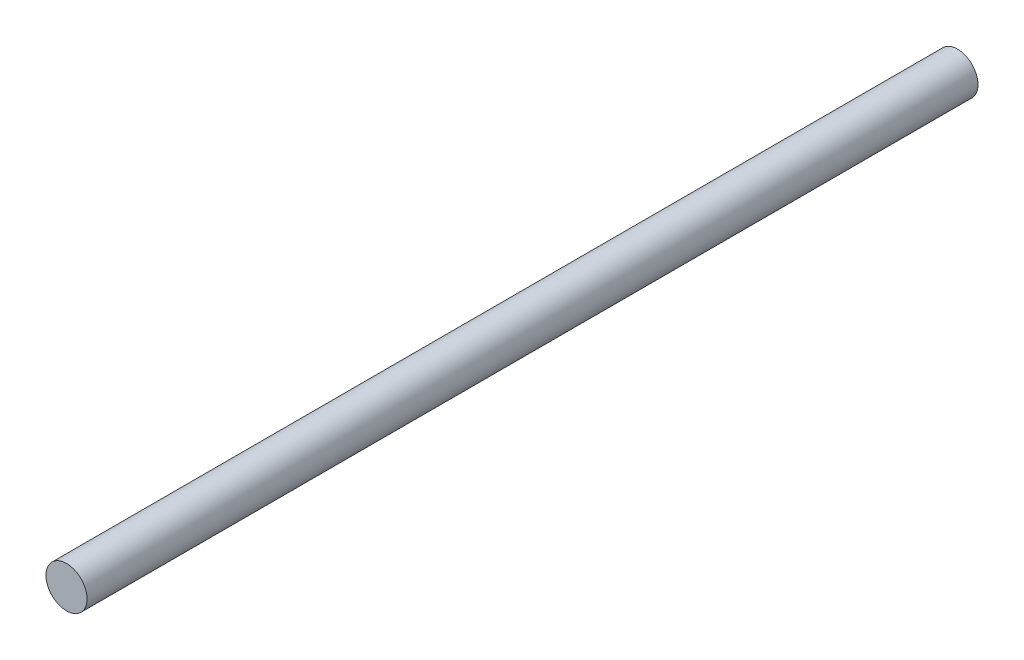
ISO-10303-21;
HEADER;
FILE_DESCRIPTION(('STEP AP214'),'2;1');
FILE_NAME('part.step','',(''),(''),'','','');
FILE_SCHEMA(('AUTOMOTIVE_DESIGN { 1 0 10303 214 1 1 1 1 }'));
ENDSEC;
DATA;
#1=APPLICATION_CONTEXT('core data for automotive mechanical design processes');
#2=APPLICATION_PROTOCOL_DEFINITION('international standard','automotive_design',2000,#1);
#3=PRODUCT_CONTEXT('',#1,'mechanical');
#4=PRODUCT('Part','Part','',(#3));
#5=PRODUCT_RELATED_PRODUCT_CATEGORY('part','',(#4));
#6=PRODUCT_DEFINITION_FORMATION('','',#4);
#7=PRODUCT_DEFINITION_CONTEXT('part definition',#1,'design');
#8=PRODUCT_DEFINITION('design','',#6,#7);
#9=PRODUCT_DEFINITION_SHAPE('','',#8);
#10=(LENGTH_UNIT() NAMED_UNIT(*) SI_UNIT(.MILLI.,.METRE.));
#11=(NAMED_UNIT(*) PLANE_ANGLE_UNIT() SI_UNIT($,.RADIAN.));
#12=(NAMED_UNIT(*) SI_UNIT($,.STERADIAN.) SOLID_ANGLE_UNIT());
#13=UNCERTAINTY_MEASURE_WITH_UNIT(LENGTH_MEASURE(1.E-05),#10,'distance_accuracy_value','');
#14=(GEOMETRIC_REPRESENTATION_CONTEXT(3) GLOBAL_UNCERTAINTY_ASSIGNED_CONTEXT((#13)) GLOBAL_UNIT_ASSIGNED_CONTEXT((#10,
#11,#12)) REPRESENTATION_CONTEXT('',''));
#15=CARTESIAN_POINT('',(0.,0.,0.));
#16=DIRECTION('',(0.,0.,1.));
#17=DIRECTION('',(1.,0.,0.));
#18=AXIS2_PLACEMENT_3D('',#15,#16,#17);
#19=CARTESIAN_POINT('',(0.,0.,103.));
#20=DIRECTION('',(0.,0.,-1.));
#21=DIRECTION('',(-1.,0.,0.));
#22=AXIS2_PLACEMENT_3D('',#19,#20,#21);
#23=CYLINDRICAL_SURFACE('',#22,2.375);
#24=CARTESIAN_POINT('',(0.,0.,103.));
#25=DIRECTION('',(0.,0.,1.));
#26=DIRECTION('',(1.,0.,0.));
#27=AXIS2_PLACEMENT_3D('',#24,#25,#26);
#28=CIRCLE('',#27,2.375);
#29=CARTESIAN_POINT('',(2.375,0.,103.));
#30=VERTEX_POINT('',#29);
#31=EDGE_CURVE('E10',#30,#30,#28,.T.);
#32=ORIENTED_EDGE('',*,*,#31,.F.);
#33=EDGE_LOOP('',(#32));
#34=FACE_BOUND('',#33,.T.);
#35=CARTESIAN_POINT('',(0.,0.,0.));
#36=DIRECTION('',(0.,0.,1.));
#37=DIRECTION('',(1.,0.,0.));
#38=AXIS2_PLACEMENT_3D('',#35,#36,#37);
#39=CIRCLE('',#38,2.375);
#40=CARTESIAN_POINT('',(2.375,0.,0.));
#41=VERTEX_POINT('',#40);
#42=EDGE_CURVE('E36',#41,#41,#39,.T.);
#43=ORIENTED_EDGE('',*,*,#42,.T.);
#44=EDGE_LOOP('',(#43));
#45=FACE_BOUND('',#44,.T.);
#46=ADVANCED_FACE('F33',(#34,#45),#23,.T.);
#47=CARTESIAN_POINT('',(0.,0.,103.));
#48=DIRECTION('',(0.,0.,1.));
#49=DIRECTION('',(1.,0.,0.));
#50=AXIS2_PLACEMENT_3D('',#47,#48,#49);
#51=PLANE('',#50);
#52=ORIENTED_EDGE('',*,*,#31,.T.);
#53=EDGE_LOOP('',(#52));
#54=FACE_BOUND('',#53,.T.);
#55=ADVANCED_FACE('F48',(#54),#51,.T.);
#56=CARTESIAN_POINT('',(0.,0.,0.));
#57=DIRECTION('',(0.,0.,1.));
#58=DIRECTION('',(1.,0.,0.));
#59=AXIS2_PLACEMENT_3D('',#56,#57,#58);
#60=PLANE('',#59);
#61=ORIENTED_EDGE('',*,*,#42,.F.);
#62=EDGE_LOOP('',(#61));
#63=FACE_BOUND('',#62,.T.);
#64=ADVANCED_FACE('F46',(#63),#60,.F.);
#65=CLOSED_SHELL('',(#46,#55,#64));
#66=MANIFOLD_SOLID_BREP('B2',#65);
#67=ADVANCED_BREP_SHAPE_REPRESENTATION('',(#18,#66),#14);
#68=SHAPE_DEFINITION_REPRESENTATION(#9,#67);
ENDSEC;
END-ISO-10303-21;
